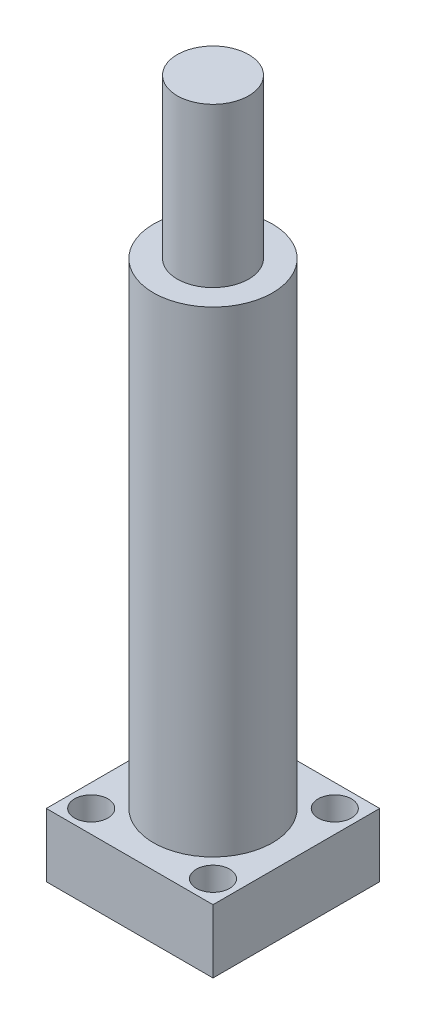
ISO-10303-21;
HEADER;
FILE_DESCRIPTION(('STEP AP214'),'2;1');
FILE_NAME('part.step','',(''),(''),'','','');
FILE_SCHEMA(('AUTOMOTIVE_DESIGN { 1 0 10303 214 1 1 1 1 }'));
ENDSEC;
DATA;
#1=APPLICATION_CONTEXT('core data for automotive mechanical design processes');
#2=APPLICATION_PROTOCOL_DEFINITION('international standard','automotive_design',2000,#1);
#3=PRODUCT_CONTEXT('',#1,'mechanical');
#4=PRODUCT('Part','Part','',(#3));
#5=PRODUCT_RELATED_PRODUCT_CATEGORY('part','',(#4));
#6=PRODUCT_DEFINITION_FORMATION('','',#4);
#7=PRODUCT_DEFINITION_CONTEXT('part definition',#1,'design');
#8=PRODUCT_DEFINITION('design','',#6,#7);
#9=PRODUCT_DEFINITION_SHAPE('','',#8);
#10=(LENGTH_UNIT() NAMED_UNIT(*) SI_UNIT(.MILLI.,.METRE.));
#11=(NAMED_UNIT(*) PLANE_ANGLE_UNIT() SI_UNIT($,.RADIAN.));
#12=(NAMED_UNIT(*) SI_UNIT($,.STERADIAN.) SOLID_ANGLE_UNIT());
#13=UNCERTAINTY_MEASURE_WITH_UNIT(LENGTH_MEASURE(1.E-05),#10,'distance_accuracy_value','');
#14=(GEOMETRIC_REPRESENTATION_CONTEXT(3) GLOBAL_UNCERTAINTY_ASSIGNED_CONTEXT((#13)) GLOBAL_UNIT_ASSIGNED_CONTEXT((#10,
#11,#12)) REPRESENTATION_CONTEXT('',''));
#15=CARTESIAN_POINT('',(0.,0.,0.));
#16=DIRECTION('',(0.,0.,1.));
#17=DIRECTION('',(1.,0.,0.));
#18=AXIS2_PLACEMENT_3D('',#15,#16,#17);
#19=CARTESIAN_POINT('',(0.,68.,0.));
#20=DIRECTION('',(0.,-1.,0.));
#21=DIRECTION('',(0.,0.,-1.));
#22=AXIS2_PLACEMENT_3D('',#19,#20,#21);
#23=CYLINDRICAL_SURFACE('',#22,7.5);
#24=CARTESIAN_POINT('',(0.,68.,0.));
#25=DIRECTION('',(0.,1.,0.));
#26=DIRECTION('',(0.,0.,1.));
#27=AXIS2_PLACEMENT_3D('',#24,#25,#26);
#28=CIRCLE('',#27,7.5);
#29=CARTESIAN_POINT('',(0.,68.,7.5));
#30=VERTEX_POINT('',#29);
#31=EDGE_CURVE('E113',#30,#30,#28,.T.);
#32=ORIENTED_EDGE('',*,*,#31,.F.);
#33=EDGE_LOOP('',(#32));
#34=FACE_BOUND('',#33,.T.);
#35=CARTESIAN_POINT('',(0.,8.,0.));
#36=DIRECTION('',(0.,-1.,0.));
#37=DIRECTION('',(0.,0.,-1.));
#38=AXIS2_PLACEMENT_3D('',#35,#36,#37);
#39=CIRCLE('',#38,7.5);
#40=CARTESIAN_POINT('',(0.,8.,-7.5));
#41=VERTEX_POINT('',#40);
#42=EDGE_CURVE('E37',#41,#41,#39,.T.);
#43=ORIENTED_EDGE('',*,*,#42,.F.);
#44=EDGE_LOOP('',(#43));
#45=FACE_BOUND('',#44,.T.);
#46=ADVANCED_FACE('F34',(#34,#45),#23,.T.);
#47=CARTESIAN_POINT('',(0.,68.,0.));
#48=DIRECTION('',(0.,1.,0.));
#49=DIRECTION('',(0.,0.,1.));
#50=AXIS2_PLACEMENT_3D('',#47,#48,#49);
#51=PLANE('',#50);
#52=CARTESIAN_POINT('',(0.,68.,0.));
#53=DIRECTION('',(0.,1.,0.));
#54=DIRECTION('',(0.,0.,1.));
#55=AXIS2_PLACEMENT_3D('',#52,#53,#54);
#56=CIRCLE('',#55,4.5);
#57=CARTESIAN_POINT('',(0.,68.,4.5));
#58=VERTEX_POINT('',#57);
#59=EDGE_CURVE('E11',#58,#58,#56,.T.);
#60=ORIENTED_EDGE('',*,*,#59,.F.);
#61=EDGE_LOOP('',(#60));
#62=FACE_BOUND('',#61,.T.);
#63=ORIENTED_EDGE('',*,*,#31,.T.);
#64=EDGE_LOOP('',(#63));
#65=FACE_BOUND('',#64,.T.);
#66=ADVANCED_FACE('F124',(#62,#65),#51,.T.);
#67=CARTESIAN_POINT('',(-10.5,8.,-10.5));
#68=DIRECTION('',(-1.,0.,0.));
#69=DIRECTION('',(0.,0.,1.));
#70=AXIS2_PLACEMENT_3D('',#67,#68,#69);
#71=PLANE('',#70);
#72=DIRECTION('',(0.,0.,-1.));
#73=VECTOR('',#72,1.);
#74=CARTESIAN_POINT('',(-10.5,0.,-10.5));
#75=LINE('',#74,#73);
#76=CARTESIAN_POINT('',(-10.5,0.,10.5));
#77=VERTEX_POINT('',#76);
#78=CARTESIAN_POINT('',(-10.5,0.,-10.5));
#79=VERTEX_POINT('',#78);
#80=EDGE_CURVE('E103',#77,#79,#75,.T.);
#81=ORIENTED_EDGE('',*,*,#80,.F.);
#82=DIRECTION('',(0.,-1.,0.));
#83=VECTOR('',#82,1.);
#84=CARTESIAN_POINT('',(-10.5,8.,10.5));
#85=LINE('',#84,#83);
#86=CARTESIAN_POINT('',(-10.5,8.,10.5));
#87=VERTEX_POINT('',#86);
#88=EDGE_CURVE('E51',#87,#77,#85,.T.);
#89=ORIENTED_EDGE('',*,*,#88,.F.);
#90=DIRECTION('',(0.,0.,-1.));
#91=VECTOR('',#90,1.);
#92=CARTESIAN_POINT('',(-10.5,8.,-10.5));
#93=LINE('',#92,#91);
#94=CARTESIAN_POINT('',(-10.5,8.,-10.5));
#95=VERTEX_POINT('',#94);
#96=EDGE_CURVE('E96',#87,#95,#93,.T.);
#97=ORIENTED_EDGE('',*,*,#96,.T.);
#98=DIRECTION('',(0.,-1.,0.));
#99=VECTOR('',#98,1.);
#100=CARTESIAN_POINT('',(-10.5,8.,-10.5));
#101=LINE('',#100,#99);
#102=EDGE_CURVE('E79',#95,#79,#101,.T.);
#103=ORIENTED_EDGE('',*,*,#102,.T.);
#104=EDGE_LOOP('',(#81,#89,#97,#103));
#105=FACE_BOUND('',#104,.T.);
#106=ADVANCED_FACE('F129',(#105),#71,.T.);
#107=CARTESIAN_POINT('',(10.5,8.,10.5));
#108=DIRECTION('',(0.,0.,1.));
#109=DIRECTION('',(1.,0.,0.));
#110=AXIS2_PLACEMENT_3D('',#107,#108,#109);
#111=PLANE('',#110);
#112=DIRECTION('',(-1.,0.,0.));
#113=VECTOR('',#112,1.);
#114=CARTESIAN_POINT('',(10.5,0.,10.5));
#115=LINE('',#114,#113);
#116=CARTESIAN_POINT('',(10.5,0.,10.5));
#117=VERTEX_POINT('',#116);
#118=EDGE_CURVE('E98',#117,#77,#115,.T.);
#119=ORIENTED_EDGE('',*,*,#118,.F.);
#120=DIRECTION('',(0.,-1.,0.));
#121=VECTOR('',#120,1.);
#122=CARTESIAN_POINT('',(10.5,8.,10.5));
#123=LINE('',#122,#121);
#124=CARTESIAN_POINT('',(10.5,8.,10.5));
#125=VERTEX_POINT('',#124);
#126=EDGE_CURVE('E68',#125,#117,#123,.T.);
#127=ORIENTED_EDGE('',*,*,#126,.F.);
#128=DIRECTION('',(-1.,0.,0.));
#129=VECTOR('',#128,1.);
#130=CARTESIAN_POINT('',(10.5,8.,10.5));
#131=LINE('',#130,#129);
#132=EDGE_CURVE('E93',#125,#87,#131,.T.);
#133=ORIENTED_EDGE('',*,*,#132,.T.);
#134=ORIENTED_EDGE('',*,*,#88,.T.);
#135=EDGE_LOOP('',(#119,#127,#133,#134));
#136=FACE_BOUND('',#135,.T.);
#137=ADVANCED_FACE('F135',(#136),#111,.T.);
#138=CARTESIAN_POINT('',(10.5,8.,-10.5));
#139=DIRECTION('',(1.,0.,0.));
#140=DIRECTION('',(0.,0.,-1.));
#141=AXIS2_PLACEMENT_3D('',#138,#139,#140);
#142=PLANE('',#141);
#143=DIRECTION('',(0.,0.,1.));
#144=VECTOR('',#143,1.);
#145=CARTESIAN_POINT('',(10.5,0.,-10.5));
#146=LINE('',#145,#144);
#147=CARTESIAN_POINT('',(10.5,0.,-10.5));
#148=VERTEX_POINT('',#147);
#149=EDGE_CURVE('E87',#148,#117,#146,.T.);
#150=ORIENTED_EDGE('',*,*,#149,.F.);
#151=DIRECTION('',(0.,-1.,0.));
#152=VECTOR('',#151,1.);
#153=CARTESIAN_POINT('',(10.5,8.,-10.5));
#154=LINE('',#153,#152);
#155=CARTESIAN_POINT('',(10.5,8.,-10.5));
#156=VERTEX_POINT('',#155);
#157=EDGE_CURVE('E82',#156,#148,#154,.T.);
#158=ORIENTED_EDGE('',*,*,#157,.F.);
#159=DIRECTION('',(0.,0.,1.));
#160=VECTOR('',#159,1.);
#161=CARTESIAN_POINT('',(10.5,8.,-10.5));
#162=LINE('',#161,#160);
#163=EDGE_CURVE('E85',#156,#125,#162,.T.);
#164=ORIENTED_EDGE('',*,*,#163,.T.);
#165=ORIENTED_EDGE('',*,*,#126,.T.);
#166=EDGE_LOOP('',(#150,#158,#164,#165));
#167=FACE_BOUND('',#166,.T.);
#168=ADVANCED_FACE('F84',(#167),#142,.T.);
#169=CARTESIAN_POINT('',(10.5,8.,-10.5));
#170=DIRECTION('',(0.,0.,-1.));
#171=DIRECTION('',(-1.,0.,0.));
#172=AXIS2_PLACEMENT_3D('',#169,#170,#171);
#173=PLANE('',#172);
#174=DIRECTION('',(1.,0.,0.));
#175=VECTOR('',#174,1.);
#176=CARTESIAN_POINT('',(10.5,0.,-10.5));
#177=LINE('',#176,#175);
#178=EDGE_CURVE('E106',#79,#148,#177,.T.);
#179=ORIENTED_EDGE('',*,*,#178,.F.);
#180=ORIENTED_EDGE('',*,*,#102,.F.);
#181=DIRECTION('',(1.,0.,0.));
#182=VECTOR('',#181,1.);
#183=CARTESIAN_POINT('',(10.5,8.,-10.5));
#184=LINE('',#183,#182);
#185=EDGE_CURVE('E92',#95,#156,#184,.T.);
#186=ORIENTED_EDGE('',*,*,#185,.T.);
#187=ORIENTED_EDGE('',*,*,#157,.T.);
#188=EDGE_LOOP('',(#179,#180,#186,#187));
#189=FACE_BOUND('',#188,.T.);
#190=ADVANCED_FACE('F95',(#189),#173,.T.);
#191=CARTESIAN_POINT('',(0.,8.,0.));
#192=DIRECTION('',(0.,-1.,0.));
#193=DIRECTION('',(0.,0.,-1.));
#194=AXIS2_PLACEMENT_3D('',#191,#192,#193);
#195=PLANE('',#194);
#196=ORIENTED_EDGE('',*,*,#42,.T.);
#197=EDGE_LOOP('',(#196));
#198=FACE_BOUND('',#197,.T.);
#199=CARTESIAN_POINT('',(-7.67157287525381,8.,-7.67157287525381));
#200=DIRECTION('',(0.,-1.,0.));
#201=DIRECTION('',(0.,0.,-1.));
#202=AXIS2_PLACEMENT_3D('',#199,#200,#201);
#203=CIRCLE('',#202,2.1);
#204=CARTESIAN_POINT('',(-7.67157287525381,8.,-9.77157287525381));
#205=VERTEX_POINT('',#204);
#206=EDGE_CURVE('E207',#205,#205,#203,.T.);
#207=ORIENTED_EDGE('',*,*,#206,.T.);
#208=EDGE_LOOP('',(#207));
#209=FACE_BOUND('',#208,.T.);
#210=CARTESIAN_POINT('',(7.67157287525382,8.,7.67157287525382));
#211=DIRECTION('',(0.,-1.,0.));
#212=DIRECTION('',(0.,0.,-1.));
#213=AXIS2_PLACEMENT_3D('',#210,#211,#212);
#214=CIRCLE('',#213,2.1);
#215=CARTESIAN_POINT('',(7.67157287525382,8.,5.57157287525382));
#216=VERTEX_POINT('',#215);
#217=EDGE_CURVE('E212',#216,#216,#214,.T.);
#218=ORIENTED_EDGE('',*,*,#217,.T.);
#219=EDGE_LOOP('',(#218));
#220=FACE_BOUND('',#219,.T.);
#221=CARTESIAN_POINT('',(7.67157287525381,8.,-7.67157287525382));
#222=DIRECTION('',(0.,-1.,0.));
#223=DIRECTION('',(0.,0.,-1.));
#224=AXIS2_PLACEMENT_3D('',#221,#222,#223);
#225=CIRCLE('',#224,2.1);
#226=CARTESIAN_POINT('',(7.67157287525381,8.,-9.77157287525381));
#227=VERTEX_POINT('',#226);
#228=EDGE_CURVE('E216',#227,#227,#225,.T.);
#229=ORIENTED_EDGE('',*,*,#228,.T.);
#230=EDGE_LOOP('',(#229));
#231=FACE_BOUND('',#230,.T.);
#232=CARTESIAN_POINT('',(-7.67157287525381,8.,7.67157287525381));
#233=DIRECTION('',(0.,-1.,0.));
#234=DIRECTION('',(0.,0.,-1.));
#235=AXIS2_PLACEMENT_3D('',#232,#233,#234);
#236=CIRCLE('',#235,2.1);
#237=CARTESIAN_POINT('',(-7.67157287525381,8.,5.57157287525381));
#238=VERTEX_POINT('',#237);
#239=EDGE_CURVE('E107',#238,#238,#236,.T.);
#240=ORIENTED_EDGE('',*,*,#239,.T.);
#241=EDGE_LOOP('',(#240));
#242=FACE_BOUND('',#241,.T.);
#243=ORIENTED_EDGE('',*,*,#96,.F.);
#244=ORIENTED_EDGE('',*,*,#132,.F.);
#245=ORIENTED_EDGE('',*,*,#163,.F.);
#246=ORIENTED_EDGE('',*,*,#185,.F.);
#247=EDGE_LOOP('',(#243,#244,#245,#246));
#248=FACE_BOUND('',#247,.T.);
#249=ADVANCED_FACE('F91',(#198,#209,#220,#231,#242,#248),#195,.F.);
#250=CARTESIAN_POINT('',(-7.67157287525381,8.,7.67157287525381));
#251=DIRECTION('',(0.,-1.,0.));
#252=DIRECTION('',(0.,0.,-1.));
#253=AXIS2_PLACEMENT_3D('',#250,#251,#252);
#254=CYLINDRICAL_SURFACE('',#253,2.1);
#255=ORIENTED_EDGE('',*,*,#239,.F.);
#256=EDGE_LOOP('',(#255));
#257=FACE_BOUND('',#256,.T.);
#258=CARTESIAN_POINT('',(-7.67157287525381,0.,7.67157287525381));
#259=DIRECTION('',(0.,-1.,0.));
#260=DIRECTION('',(0.,0.,-1.));
#261=AXIS2_PLACEMENT_3D('',#258,#259,#260);
#262=CIRCLE('',#261,2.1);
#263=CARTESIAN_POINT('',(-7.67157287525381,0.,5.57157287525381));
#264=VERTEX_POINT('',#263);
#265=EDGE_CURVE('E169',#264,#264,#262,.T.);
#266=ORIENTED_EDGE('',*,*,#265,.T.);
#267=EDGE_LOOP('',(#266));
#268=FACE_BOUND('',#267,.T.);
#269=ADVANCED_FACE('F182',(#257,#268),#254,.F.);
#270=CARTESIAN_POINT('',(7.67157287525381,8.,-7.67157287525382));
#271=DIRECTION('',(0.,-1.,0.));
#272=DIRECTION('',(0.,0.,-1.));
#273=AXIS2_PLACEMENT_3D('',#270,#271,#272);
#274=CYLINDRICAL_SURFACE('',#273,2.1);
#275=ORIENTED_EDGE('',*,*,#228,.F.);
#276=EDGE_LOOP('',(#275));
#277=FACE_BOUND('',#276,.T.);
#278=CARTESIAN_POINT('',(7.67157287525381,0.,-7.67157287525382));
#279=DIRECTION('',(0.,-1.,0.));
#280=DIRECTION('',(0.,0.,-1.));
#281=AXIS2_PLACEMENT_3D('',#278,#279,#280);
#282=CIRCLE('',#281,2.1);
#283=CARTESIAN_POINT('',(7.67157287525381,0.,-9.77157287525381));
#284=VERTEX_POINT('',#283);
#285=EDGE_CURVE('E165',#284,#284,#282,.T.);
#286=ORIENTED_EDGE('',*,*,#285,.T.);
#287=EDGE_LOOP('',(#286));
#288=FACE_BOUND('',#287,.T.);
#289=ADVANCED_FACE('F186',(#277,#288),#274,.F.);
#290=CARTESIAN_POINT('',(7.67157287525382,8.,7.67157287525382));
#291=DIRECTION('',(0.,-1.,0.));
#292=DIRECTION('',(0.,0.,-1.));
#293=AXIS2_PLACEMENT_3D('',#290,#291,#292);
#294=CYLINDRICAL_SURFACE('',#293,2.1);
#295=ORIENTED_EDGE('',*,*,#217,.F.);
#296=EDGE_LOOP('',(#295));
#297=FACE_BOUND('',#296,.T.);
#298=CARTESIAN_POINT('',(7.67157287525382,0.,7.67157287525382));
#299=DIRECTION('',(0.,-1.,0.));
#300=DIRECTION('',(0.,0.,-1.));
#301=AXIS2_PLACEMENT_3D('',#298,#299,#300);
#302=CIRCLE('',#301,2.1);
#303=CARTESIAN_POINT('',(7.67157287525382,0.,5.57157287525382));
#304=VERTEX_POINT('',#303);
#305=EDGE_CURVE('E161',#304,#304,#302,.T.);
#306=ORIENTED_EDGE('',*,*,#305,.T.);
#307=EDGE_LOOP('',(#306));
#308=FACE_BOUND('',#307,.T.);
#309=ADVANCED_FACE('F151',(#297,#308),#294,.F.);
#310=CARTESIAN_POINT('',(-7.67157287525381,8.,-7.67157287525381));
#311=DIRECTION('',(0.,-1.,0.));
#312=DIRECTION('',(0.,0.,-1.));
#313=AXIS2_PLACEMENT_3D('',#310,#311,#312);
#314=CYLINDRICAL_SURFACE('',#313,2.1);
#315=ORIENTED_EDGE('',*,*,#206,.F.);
#316=EDGE_LOOP('',(#315));
#317=FACE_BOUND('',#316,.T.);
#318=CARTESIAN_POINT('',(-7.67157287525381,0.,-7.67157287525381));
#319=DIRECTION('',(0.,-1.,0.));
#320=DIRECTION('',(0.,0.,-1.));
#321=AXIS2_PLACEMENT_3D('',#318,#319,#320);
#322=CIRCLE('',#321,2.1);
#323=CARTESIAN_POINT('',(-7.67157287525381,0.,-9.77157287525381));
#324=VERTEX_POINT('',#323);
#325=EDGE_CURVE('E157',#324,#324,#322,.T.);
#326=ORIENTED_EDGE('',*,*,#325,.T.);
#327=EDGE_LOOP('',(#326));
#328=FACE_BOUND('',#327,.T.);
#329=ADVANCED_FACE('F142',(#317,#328),#314,.F.);
#330=CARTESIAN_POINT('',(0.,0.,0.));
#331=DIRECTION('',(0.,1.,0.));
#332=DIRECTION('',(0.,0.,1.));
#333=AXIS2_PLACEMENT_3D('',#330,#331,#332);
#334=PLANE('',#333);
#335=ORIENTED_EDGE('',*,*,#325,.F.);
#336=EDGE_LOOP('',(#335));
#337=FACE_BOUND('',#336,.T.);
#338=ORIENTED_EDGE('',*,*,#305,.F.);
#339=EDGE_LOOP('',(#338));
#340=FACE_BOUND('',#339,.T.);
#341=ORIENTED_EDGE('',*,*,#285,.F.);
#342=EDGE_LOOP('',(#341));
#343=FACE_BOUND('',#342,.T.);
#344=ORIENTED_EDGE('',*,*,#265,.F.);
#345=EDGE_LOOP('',(#344));
#346=FACE_BOUND('',#345,.T.);
#347=ORIENTED_EDGE('',*,*,#80,.T.);
#348=ORIENTED_EDGE('',*,*,#178,.T.);
#349=ORIENTED_EDGE('',*,*,#149,.T.);
#350=ORIENTED_EDGE('',*,*,#118,.T.);
#351=EDGE_LOOP('',(#347,#348,#349,#350));
#352=FACE_BOUND('',#351,.T.);
#353=ADVANCED_FACE('F139',(#337,#340,#343,#346,#352),#334,.F.);
#354=CARTESIAN_POINT('',(0.,88.,0.));
#355=DIRECTION('',(0.,-1.,0.));
#356=DIRECTION('',(0.,0.,-1.));
#357=AXIS2_PLACEMENT_3D('',#354,#355,#356);
#358=CYLINDRICAL_SURFACE('',#357,4.5);
#359=CARTESIAN_POINT('',(0.,88.,0.));
#360=DIRECTION('',(0.,1.,0.));
#361=DIRECTION('',(0.,0.,1.));
#362=AXIS2_PLACEMENT_3D('',#359,#360,#361);
#363=CIRCLE('',#362,4.5);
#364=CARTESIAN_POINT('',(0.,88.,4.5));
#365=VERTEX_POINT('',#364);
#366=EDGE_CURVE('E205',#365,#365,#363,.T.);
#367=ORIENTED_EDGE('',*,*,#366,.F.);
#368=EDGE_LOOP('',(#367));
#369=FACE_BOUND('',#368,.T.);
#370=ORIENTED_EDGE('',*,*,#59,.T.);
#371=EDGE_LOOP('',(#370));
#372=FACE_BOUND('',#371,.T.);
#373=ADVANCED_FACE('F141',(#369,#372),#358,.T.);
#374=CARTESIAN_POINT('',(0.,88.,0.));
#375=DIRECTION('',(0.,1.,0.));
#376=DIRECTION('',(0.,0.,1.));
#377=AXIS2_PLACEMENT_3D('',#374,#375,#376);
#378=PLANE('',#377);
#379=ORIENTED_EDGE('',*,*,#366,.T.);
#380=EDGE_LOOP('',(#379));
#381=FACE_BOUND('',#380,.T.);
#382=ADVANCED_FACE('F148',(#381),#378,.T.);
#383=CLOSED_SHELL('',(#46,#66,#106,#137,#168,#190,#249,#269,#289,#309,#329,#353,#373,#382));
#384=MANIFOLD_SOLID_BREP('B2',#383);
#385=ADVANCED_BREP_SHAPE_REPRESENTATION('',(#18,#384),#14);
#386=SHAPE_DEFINITION_REPRESENTATION(#9,#385);
ENDSEC;
END-ISO-10303-21;
